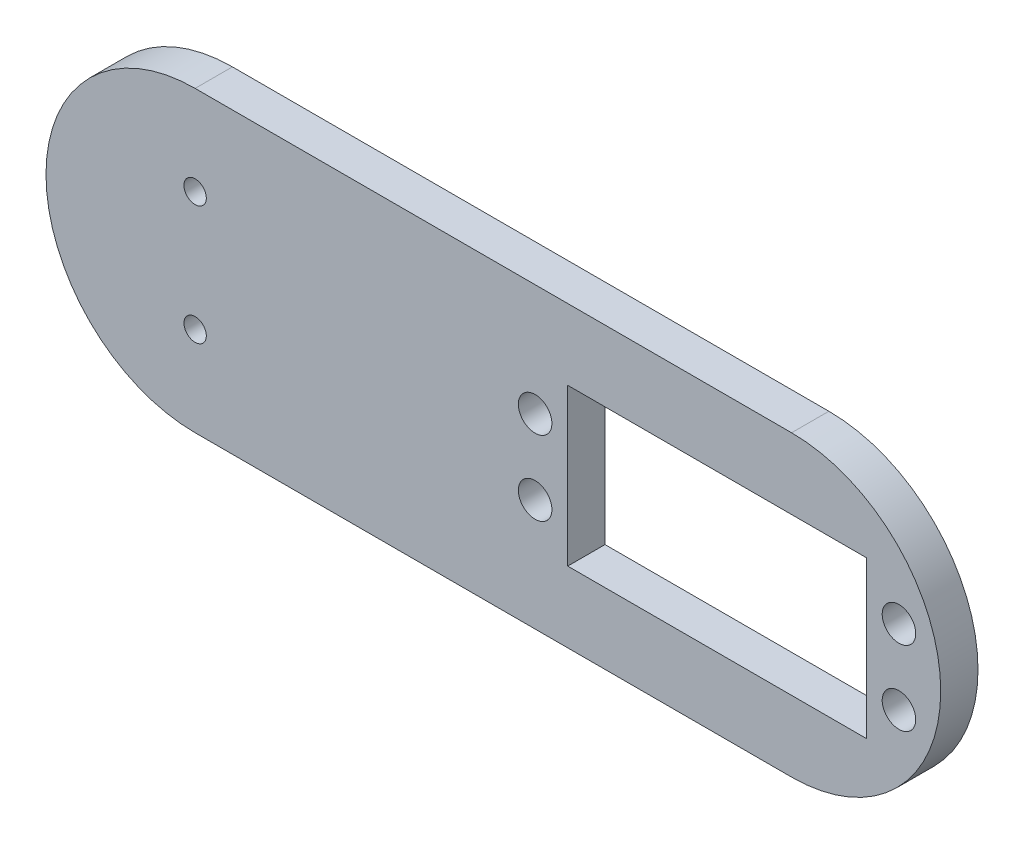
ISO-10303-21;
HEADER;
FILE_DESCRIPTION(('STEP AP214'),'2;1');
FILE_NAME('part.step','',(''),(''),'','','');
FILE_SCHEMA(('AUTOMOTIVE_DESIGN { 1 0 10303 214 1 1 1 1 }'));
ENDSEC;
DATA;
#1=APPLICATION_CONTEXT('core data for automotive mechanical design processes');
#2=APPLICATION_PROTOCOL_DEFINITION('international standard','automotive_design',2000,#1);
#3=PRODUCT_CONTEXT('',#1,'mechanical');
#4=PRODUCT('Part','Part','',(#3));
#5=PRODUCT_RELATED_PRODUCT_CATEGORY('part','',(#4));
#6=PRODUCT_DEFINITION_FORMATION('','',#4);
#7=PRODUCT_DEFINITION_CONTEXT('part definition',#1,'design');
#8=PRODUCT_DEFINITION('design','',#6,#7);
#9=PRODUCT_DEFINITION_SHAPE('','',#8);
#10=(LENGTH_UNIT() NAMED_UNIT(*) SI_UNIT(.MILLI.,.METRE.));
#11=(NAMED_UNIT(*) PLANE_ANGLE_UNIT() SI_UNIT($,.RADIAN.));
#12=(NAMED_UNIT(*) SI_UNIT($,.STERADIAN.) SOLID_ANGLE_UNIT());
#13=UNCERTAINTY_MEASURE_WITH_UNIT(LENGTH_MEASURE(1.E-05),#10,'distance_accuracy_value','');
#14=(GEOMETRIC_REPRESENTATION_CONTEXT(3) GLOBAL_UNCERTAINTY_ASSIGNED_CONTEXT((#13)) GLOBAL_UNIT_ASSIGNED_CONTEXT((#10,
#11,#12)) REPRESENTATION_CONTEXT('',''));
#15=CARTESIAN_POINT('',(0.,0.,0.));
#16=DIRECTION('',(0.,0.,1.));
#17=DIRECTION('',(1.,0.,0.));
#18=AXIS2_PLACEMENT_3D('',#15,#16,#17);
#19=CARTESIAN_POINT('',(-120.,0.,0.));
#20=DIRECTION('',(0.,0.,-1.));
#21=DIRECTION('',(0.,1.,0.));
#22=AXIS2_PLACEMENT_3D('',#19,#20,#21);
#23=CYLINDRICAL_SURFACE('',#22,20.);
#24=CARTESIAN_POINT('',(-120.,0.,-5.));
#25=DIRECTION('',(0.,0.,1.));
#26=DIRECTION('',(0.,-1.,0.));
#27=AXIS2_PLACEMENT_3D('',#24,#25,#26);
#28=CIRCLE('',#27,20.);
#29=CARTESIAN_POINT('',(-120.,20.,-4.99999999999993));
#30=VERTEX_POINT('',#29);
#31=CARTESIAN_POINT('',(-120.,-20.,-5.00000000000007));
#32=VERTEX_POINT('',#31);
#33=EDGE_CURVE('E168',#30,#32,#28,.T.);
#34=ORIENTED_EDGE('',*,*,#33,.T.);
#35=DIRECTION('',(0.,0.,-1.));
#36=VECTOR('',#35,1.);
#37=CARTESIAN_POINT('',(-120.,-20.,0.));
#38=LINE('',#37,#36);
#39=CARTESIAN_POINT('',(-120.,-20.,0.));
#40=VERTEX_POINT('',#39);
#41=EDGE_CURVE('E11',#40,#32,#38,.T.);
#42=ORIENTED_EDGE('',*,*,#41,.F.);
#43=CARTESIAN_POINT('',(-120.,0.,0.));
#44=DIRECTION('',(0.,0.,1.));
#45=DIRECTION('',(0.,-1.,0.));
#46=AXIS2_PLACEMENT_3D('',#43,#44,#45);
#47=CIRCLE('',#46,20.);
#48=CARTESIAN_POINT('',(-120.,20.,0.));
#49=VERTEX_POINT('',#48);
#50=EDGE_CURVE('E173',#49,#40,#47,.T.);
#51=ORIENTED_EDGE('',*,*,#50,.F.);
#52=DIRECTION('',(0.,0.,-1.));
#53=VECTOR('',#52,1.);
#54=CARTESIAN_POINT('',(-120.,20.,0.));
#55=LINE('',#54,#53);
#56=EDGE_CURVE('E184',#49,#30,#55,.T.);
#57=ORIENTED_EDGE('',*,*,#56,.T.);
#58=EDGE_LOOP('',(#34,#42,#51,#57));
#59=FACE_BOUND('',#58,.T.);
#60=ADVANCED_FACE('F39',(#59),#23,.T.);
#61=CARTESIAN_POINT('',(-40.,-20.,0.));
#62=DIRECTION('',(0.,-1.,0.));
#63=DIRECTION('',(1.,0.,0.));
#64=AXIS2_PLACEMENT_3D('',#61,#62,#63);
#65=PLANE('',#64);
#66=DIRECTION('',(-1.,0.,0.));
#67=VECTOR('',#66,1.);
#68=CARTESIAN_POINT('',(-40.,-20.,-5.00000000000007));
#69=LINE('',#68,#67);
#70=CARTESIAN_POINT('',(-40.,-20.,-5.00000000000007));
#71=VERTEX_POINT('',#70);
#72=EDGE_CURVE('E187',#71,#32,#69,.T.);
#73=ORIENTED_EDGE('',*,*,#72,.F.);
#74=DIRECTION('',(0.,0.,-1.));
#75=VECTOR('',#74,1.);
#76=CARTESIAN_POINT('',(-40.,-20.,0.));
#77=LINE('',#76,#75);
#78=CARTESIAN_POINT('',(-40.,-20.,0.));
#79=VERTEX_POINT('',#78);
#80=EDGE_CURVE('E46',#79,#71,#77,.T.);
#81=ORIENTED_EDGE('',*,*,#80,.F.);
#82=DIRECTION('',(-1.,0.,0.));
#83=VECTOR('',#82,1.);
#84=CARTESIAN_POINT('',(-40.,-20.,0.));
#85=LINE('',#84,#83);
#86=EDGE_CURVE('E175',#79,#40,#85,.T.);
#87=ORIENTED_EDGE('',*,*,#86,.T.);
#88=ORIENTED_EDGE('',*,*,#41,.T.);
#89=EDGE_LOOP('',(#73,#81,#87,#88));
#90=FACE_BOUND('',#89,.T.);
#91=ADVANCED_FACE('F208',(#90),#65,.T.);
#92=CARTESIAN_POINT('',(-40.,0.,0.));
#93=DIRECTION('',(0.,0.,-1.));
#94=DIRECTION('',(0.,1.,0.));
#95=AXIS2_PLACEMENT_3D('',#92,#93,#94);
#96=CYLINDRICAL_SURFACE('',#95,20.);
#97=CARTESIAN_POINT('',(-40.,0.,-5.));
#98=DIRECTION('',(0.,0.,1.));
#99=DIRECTION('',(0.,-1.,0.));
#100=AXIS2_PLACEMENT_3D('',#97,#98,#99);
#101=CIRCLE('',#100,20.);
#102=CARTESIAN_POINT('',(-40.,20.,-4.99999999999993));
#103=VERTEX_POINT('',#102);
#104=EDGE_CURVE('E190',#71,#103,#101,.T.);
#105=ORIENTED_EDGE('',*,*,#104,.T.);
#106=DIRECTION('',(0.,0.,-1.));
#107=VECTOR('',#106,1.);
#108=CARTESIAN_POINT('',(-40.,20.,0.));
#109=LINE('',#108,#107);
#110=CARTESIAN_POINT('',(-40.,20.,0.));
#111=VERTEX_POINT('',#110);
#112=EDGE_CURVE('E196',#111,#103,#109,.T.);
#113=ORIENTED_EDGE('',*,*,#112,.F.);
#114=CARTESIAN_POINT('',(-40.,0.,0.));
#115=DIRECTION('',(0.,0.,1.));
#116=DIRECTION('',(0.,-1.,0.));
#117=AXIS2_PLACEMENT_3D('',#114,#115,#116);
#118=CIRCLE('',#117,20.);
#119=EDGE_CURVE('E179',#79,#111,#118,.T.);
#120=ORIENTED_EDGE('',*,*,#119,.F.);
#121=ORIENTED_EDGE('',*,*,#80,.T.);
#122=EDGE_LOOP('',(#105,#113,#120,#121));
#123=FACE_BOUND('',#122,.T.);
#124=ADVANCED_FACE('F200',(#123),#96,.T.);
#125=CARTESIAN_POINT('',(-120.,20.,0.));
#126=DIRECTION('',(0.,1.,0.));
#127=DIRECTION('',(-1.,0.,0.));
#128=AXIS2_PLACEMENT_3D('',#125,#126,#127);
#129=PLANE('',#128);
#130=DIRECTION('',(1.,0.,0.));
#131=VECTOR('',#130,1.);
#132=CARTESIAN_POINT('',(-120.,20.,-4.99999999999993));
#133=LINE('',#132,#131);
#134=EDGE_CURVE('E176',#30,#103,#133,.T.);
#135=ORIENTED_EDGE('',*,*,#134,.F.);
#136=ORIENTED_EDGE('',*,*,#56,.F.);
#137=DIRECTION('',(1.,0.,0.));
#138=VECTOR('',#137,1.);
#139=CARTESIAN_POINT('',(-120.,20.,0.));
#140=LINE('',#139,#138);
#141=EDGE_CURVE('E181',#49,#111,#140,.T.);
#142=ORIENTED_EDGE('',*,*,#141,.T.);
#143=ORIENTED_EDGE('',*,*,#112,.T.);
#144=EDGE_LOOP('',(#135,#136,#142,#143));
#145=FACE_BOUND('',#144,.T.);
#146=ADVANCED_FACE('F213',(#145),#129,.T.);
#147=CARTESIAN_POINT('',(-120.,0.,0.));
#148=DIRECTION('',(0.,0.,1.));
#149=DIRECTION('',(0.,-1.,0.));
#150=AXIS2_PLACEMENT_3D('',#147,#148,#149);
#151=PLANE('',#150);
#152=CARTESIAN_POINT('',(-25.6,4.99999999999998,0.));
#153=DIRECTION('',(0.,0.,1.));
#154=DIRECTION('',(-1.,0.,0.));
#155=AXIS2_PLACEMENT_3D('',#152,#153,#154);
#156=CIRCLE('',#155,2.25000000000001);
#157=CARTESIAN_POINT('',(-27.85,4.99999999999998,0.));
#158=VERTEX_POINT('',#157);
#159=EDGE_CURVE('E145',#158,#158,#156,.T.);
#160=ORIENTED_EDGE('',*,*,#159,.F.);
#161=EDGE_LOOP('',(#160));
#162=FACE_BOUND('',#161,.T.);
#163=CARTESIAN_POINT('',(-74.4,-5.00000000000036,0.));
#164=DIRECTION('',(0.,0.,1.));
#165=DIRECTION('',(1.,0.,0.));
#166=AXIS2_PLACEMENT_3D('',#163,#164,#165);
#167=CIRCLE('',#166,2.25);
#168=CARTESIAN_POINT('',(-72.15,-5.00000000000036,0.));
#169=VERTEX_POINT('',#168);
#170=EDGE_CURVE('E151',#169,#169,#167,.T.);
#171=ORIENTED_EDGE('',*,*,#170,.F.);
#172=EDGE_LOOP('',(#171));
#173=FACE_BOUND('',#172,.T.);
#174=CARTESIAN_POINT('',(-74.4,4.99999999999964,0.));
#175=DIRECTION('',(0.,0.,1.));
#176=DIRECTION('',(-1.,0.,0.));
#177=AXIS2_PLACEMENT_3D('',#174,#175,#176);
#178=CIRCLE('',#177,2.25);
#179=CARTESIAN_POINT('',(-76.65,4.99999999999964,0.));
#180=VERTEX_POINT('',#179);
#181=EDGE_CURVE('E126',#180,#180,#178,.T.);
#182=ORIENTED_EDGE('',*,*,#181,.F.);
#183=EDGE_LOOP('',(#182));
#184=FACE_BOUND('',#183,.T.);
#185=DIRECTION('',(0.,1.,0.));
#186=VECTOR('',#185,1.);
#187=CARTESIAN_POINT('',(-29.975,-10.5,0.));
#188=LINE('',#187,#186);
#189=CARTESIAN_POINT('',(-29.975,-10.5,0.));
#190=VERTEX_POINT('',#189);
#191=CARTESIAN_POINT('',(-29.975,10.5,0.));
#192=VERTEX_POINT('',#191);
#193=EDGE_CURVE('E53',#190,#192,#188,.T.);
#194=ORIENTED_EDGE('',*,*,#193,.F.);
#195=DIRECTION('',(1.,0.,0.));
#196=VECTOR('',#195,1.);
#197=CARTESIAN_POINT('',(-70.025,-10.5,0.));
#198=LINE('',#197,#196);
#199=CARTESIAN_POINT('',(-70.025,-10.5,0.));
#200=VERTEX_POINT('',#199);
#201=EDGE_CURVE('E120',#200,#190,#198,.T.);
#202=ORIENTED_EDGE('',*,*,#201,.F.);
#203=DIRECTION('',(0.,-1.,0.));
#204=VECTOR('',#203,1.);
#205=CARTESIAN_POINT('',(-70.025,-10.5,0.));
#206=LINE('',#205,#204);
#207=CARTESIAN_POINT('',(-70.025,10.5,0.));
#208=VERTEX_POINT('',#207);
#209=EDGE_CURVE('E123',#208,#200,#206,.T.);
#210=ORIENTED_EDGE('',*,*,#209,.F.);
#211=DIRECTION('',(-1.,0.,0.));
#212=VECTOR('',#211,1.);
#213=CARTESIAN_POINT('',(-70.025,10.5,0.));
#214=LINE('',#213,#212);
#215=EDGE_CURVE('E132',#192,#208,#214,.T.);
#216=ORIENTED_EDGE('',*,*,#215,.F.);
#217=EDGE_LOOP('',(#194,#202,#210,#216));
#218=FACE_BOUND('',#217,.T.);
#219=CARTESIAN_POINT('',(-25.6,-5.00000000000002,0.));
#220=DIRECTION('',(0.,0.,1.));
#221=DIRECTION('',(1.,0.,0.));
#222=AXIS2_PLACEMENT_3D('',#219,#220,#221);
#223=CIRCLE('',#222,2.25000000000001);
#224=CARTESIAN_POINT('',(-23.35,-5.00000000000002,0.));
#225=VERTEX_POINT('',#224);
#226=EDGE_CURVE('E144',#225,#225,#223,.T.);
#227=ORIENTED_EDGE('',*,*,#226,.F.);
#228=EDGE_LOOP('',(#227));
#229=FACE_BOUND('',#228,.T.);
#230=CARTESIAN_POINT('',(-119.998000000016,7.99999987499999,0.));
#231=DIRECTION('',(0.,0.,1.));
#232=DIRECTION('',(0.,-1.,0.));
#233=AXIS2_PLACEMENT_3D('',#230,#231,#232);
#234=CIRCLE('',#233,1.5);
#235=CARTESIAN_POINT('',(-119.998000000016,6.49999987499999,0.));
#236=VERTEX_POINT('',#235);
#237=EDGE_CURVE('E161',#236,#236,#234,.T.);
#238=ORIENTED_EDGE('',*,*,#237,.F.);
#239=EDGE_LOOP('',(#238));
#240=FACE_BOUND('',#239,.T.);
#241=CARTESIAN_POINT('',(-119.998000000016,-8.00000025000001,0.));
#242=DIRECTION('',(0.,0.,1.));
#243=DIRECTION('',(0.,-1.,0.));
#244=AXIS2_PLACEMENT_3D('',#241,#242,#243);
#245=CIRCLE('',#244,1.5);
#246=CARTESIAN_POINT('',(-119.998000000016,-9.50000025000001,0.));
#247=VERTEX_POINT('',#246);
#248=EDGE_CURVE('E165',#247,#247,#245,.T.);
#249=ORIENTED_EDGE('',*,*,#248,.F.);
#250=EDGE_LOOP('',(#249));
#251=FACE_BOUND('',#250,.T.);
#252=ORIENTED_EDGE('',*,*,#50,.T.);
#253=ORIENTED_EDGE('',*,*,#86,.F.);
#254=ORIENTED_EDGE('',*,*,#119,.T.);
#255=ORIENTED_EDGE('',*,*,#141,.F.);
#256=EDGE_LOOP('',(#252,#253,#254,#255));
#257=FACE_BOUND('',#256,.T.);
#258=ADVANCED_FACE('F216',(#162,#173,#184,#218,#229,#240,#251,#257),#151,.T.);
#259=CARTESIAN_POINT('',(-120.,0.,-5.));
#260=DIRECTION('',(0.,0.,1.));
#261=DIRECTION('',(0.,-1.,0.));
#262=AXIS2_PLACEMENT_3D('',#259,#260,#261);
#263=PLANE('',#262);
#264=CARTESIAN_POINT('',(-25.6,4.99999999999998,-5.00000000000007));
#265=DIRECTION('',(0.,0.,1.));
#266=DIRECTION('',(-1.,0.,0.));
#267=AXIS2_PLACEMENT_3D('',#264,#265,#266);
#268=CIRCLE('',#267,2.25000000000001);
#269=CARTESIAN_POINT('',(-27.85,4.99999999999998,-5.00000000000007));
#270=VERTEX_POINT('',#269);
#271=EDGE_CURVE('E141',#270,#270,#268,.T.);
#272=ORIENTED_EDGE('',*,*,#271,.T.);
#273=EDGE_LOOP('',(#272));
#274=FACE_BOUND('',#273,.T.);
#275=CARTESIAN_POINT('',(-74.4,-5.00000000000036,-5.00000000000007));
#276=DIRECTION('',(0.,0.,1.));
#277=DIRECTION('',(1.,0.,0.));
#278=AXIS2_PLACEMENT_3D('',#275,#276,#277);
#279=CIRCLE('',#278,2.25);
#280=CARTESIAN_POINT('',(-72.15,-5.00000000000036,-5.00000000000007));
#281=VERTEX_POINT('',#280);
#282=EDGE_CURVE('E148',#281,#281,#279,.T.);
#283=ORIENTED_EDGE('',*,*,#282,.T.);
#284=EDGE_LOOP('',(#283));
#285=FACE_BOUND('',#284,.T.);
#286=CARTESIAN_POINT('',(-74.4,4.99999999999964,-5.00000000000007));
#287=DIRECTION('',(0.,0.,1.));
#288=DIRECTION('',(-1.,0.,0.));
#289=AXIS2_PLACEMENT_3D('',#286,#287,#288);
#290=CIRCLE('',#289,2.25);
#291=CARTESIAN_POINT('',(-76.65,4.99999999999964,-5.00000000000007));
#292=VERTEX_POINT('',#291);
#293=EDGE_CURVE('E154',#292,#292,#290,.T.);
#294=ORIENTED_EDGE('',*,*,#293,.T.);
#295=EDGE_LOOP('',(#294));
#296=FACE_BOUND('',#295,.T.);
#297=DIRECTION('',(1.,0.,0.));
#298=VECTOR('',#297,1.);
#299=CARTESIAN_POINT('',(-70.025,-10.5,-5.00000000000007));
#300=LINE('',#299,#298);
#301=CARTESIAN_POINT('',(-70.025,-10.5,-5.00000000000007));
#302=VERTEX_POINT('',#301);
#303=CARTESIAN_POINT('',(-29.975,-10.5,-5.00000000000007));
#304=VERTEX_POINT('',#303);
#305=EDGE_CURVE('E110',#302,#304,#300,.T.);
#306=ORIENTED_EDGE('',*,*,#305,.T.);
#307=DIRECTION('',(0.,1.,0.));
#308=VECTOR('',#307,1.);
#309=CARTESIAN_POINT('',(-29.975,-10.5,-5.00000000000007));
#310=LINE('',#309,#308);
#311=CARTESIAN_POINT('',(-29.975,10.5,-5.00000000000007));
#312=VERTEX_POINT('',#311);
#313=EDGE_CURVE('E104',#304,#312,#310,.T.);
#314=ORIENTED_EDGE('',*,*,#313,.T.);
#315=DIRECTION('',(-1.,0.,0.));
#316=VECTOR('',#315,1.);
#317=CARTESIAN_POINT('',(-70.025,10.5,-5.00000000000007));
#318=LINE('',#317,#316);
#319=CARTESIAN_POINT('',(-70.025,10.5,-4.99999999999996));
#320=VERTEX_POINT('',#319);
#321=EDGE_CURVE('E113',#312,#320,#318,.T.);
#322=ORIENTED_EDGE('',*,*,#321,.T.);
#323=DIRECTION('',(0.,-1.,0.));
#324=VECTOR('',#323,1.);
#325=CARTESIAN_POINT('',(-70.025,-10.5,-5.00000000000007));
#326=LINE('',#325,#324);
#327=EDGE_CURVE('E61',#320,#302,#326,.T.);
#328=ORIENTED_EDGE('',*,*,#327,.T.);
#329=EDGE_LOOP('',(#306,#314,#322,#328));
#330=FACE_BOUND('',#329,.T.);
#331=CARTESIAN_POINT('',(-25.6,-5.00000000000002,-5.00000000000007));
#332=DIRECTION('',(0.,0.,1.));
#333=DIRECTION('',(1.,0.,0.));
#334=AXIS2_PLACEMENT_3D('',#331,#332,#333);
#335=CIRCLE('',#334,2.25000000000001);
#336=CARTESIAN_POINT('',(-23.35,-5.00000000000002,-5.00000000000007));
#337=VERTEX_POINT('',#336);
#338=EDGE_CURVE('E155',#337,#337,#335,.T.);
#339=ORIENTED_EDGE('',*,*,#338,.T.);
#340=EDGE_LOOP('',(#339));
#341=FACE_BOUND('',#340,.T.);
#342=CARTESIAN_POINT('',(-119.998000000016,7.99999987500001,-4.99999999999997));
#343=DIRECTION('',(0.,0.,1.));
#344=DIRECTION('',(0.,-1.,0.));
#345=AXIS2_PLACEMENT_3D('',#342,#343,#344);
#346=CIRCLE('',#345,1.5);
#347=CARTESIAN_POINT('',(-119.998000000016,6.49999987500001,-4.99999999999998));
#348=VERTEX_POINT('',#347);
#349=EDGE_CURVE('E164',#348,#348,#346,.F.);
#350=ORIENTED_EDGE('',*,*,#349,.F.);
#351=EDGE_LOOP('',(#350));
#352=FACE_BOUND('',#351,.T.);
#353=CARTESIAN_POINT('',(-119.998000000016,-8.00000024999999,-5.00000000000003));
#354=DIRECTION('',(0.,0.,1.));
#355=DIRECTION('',(0.,-1.,0.));
#356=AXIS2_PLACEMENT_3D('',#353,#354,#355);
#357=CIRCLE('',#356,1.5);
#358=CARTESIAN_POINT('',(-119.998000000016,-9.50000024999999,-5.00000000000003));
#359=VERTEX_POINT('',#358);
#360=EDGE_CURVE('E158',#359,#359,#357,.F.);
#361=ORIENTED_EDGE('',*,*,#360,.F.);
#362=EDGE_LOOP('',(#361));
#363=FACE_BOUND('',#362,.T.);
#364=ORIENTED_EDGE('',*,*,#33,.F.);
#365=ORIENTED_EDGE('',*,*,#134,.T.);
#366=ORIENTED_EDGE('',*,*,#104,.F.);
#367=ORIENTED_EDGE('',*,*,#72,.T.);
#368=EDGE_LOOP('',(#364,#365,#366,#367));
#369=FACE_BOUND('',#368,.T.);
#370=ADVANCED_FACE('F117',(#274,#285,#296,#330,#341,#352,#363,#369),#263,.F.);
#371=CARTESIAN_POINT('',(-119.998000000016,-8.00000024999999,-5.00100000000003));
#372=DIRECTION('',(0.,0.,1.));
#373=DIRECTION('',(0.,-1.,0.));
#374=AXIS2_PLACEMENT_3D('',#371,#372,#373);
#375=CYLINDRICAL_SURFACE('',#374,1.5);
#376=ORIENTED_EDGE('',*,*,#248,.T.);
#377=EDGE_LOOP('',(#376));
#378=FACE_BOUND('',#377,.T.);
#379=ORIENTED_EDGE('',*,*,#360,.T.);
#380=EDGE_LOOP('',(#379));
#381=FACE_BOUND('',#380,.T.);
#382=ADVANCED_FACE('F224',(#378,#381),#375,.F.);
#383=CARTESIAN_POINT('',(-119.998000000016,7.99999987500001,-5.00099999999997));
#384=DIRECTION('',(0.,0.,1.));
#385=DIRECTION('',(0.,-1.,0.));
#386=AXIS2_PLACEMENT_3D('',#383,#384,#385);
#387=CYLINDRICAL_SURFACE('',#386,1.5);
#388=ORIENTED_EDGE('',*,*,#237,.T.);
#389=EDGE_LOOP('',(#388));
#390=FACE_BOUND('',#389,.T.);
#391=ORIENTED_EDGE('',*,*,#349,.T.);
#392=EDGE_LOOP('',(#391));
#393=FACE_BOUND('',#392,.T.);
#394=ADVANCED_FACE('F268',(#390,#393),#387,.F.);
#395=CARTESIAN_POINT('',(-25.6,-5.00000000000002,-5.00000000000007));
#396=DIRECTION('',(0.,0.,1.));
#397=DIRECTION('',(1.,0.,0.));
#398=AXIS2_PLACEMENT_3D('',#395,#396,#397);
#399=CYLINDRICAL_SURFACE('',#398,2.25000000000001);
#400=ORIENTED_EDGE('',*,*,#338,.F.);
#401=EDGE_LOOP('',(#400));
#402=FACE_BOUND('',#401,.T.);
#403=ORIENTED_EDGE('',*,*,#226,.T.);
#404=EDGE_LOOP('',(#403));
#405=FACE_BOUND('',#404,.T.);
#406=ADVANCED_FACE('F277',(#402,#405),#399,.F.);
#407=CARTESIAN_POINT('',(-29.975,-10.5,-5.00000000000007));
#408=DIRECTION('',(1.,0.,0.));
#409=DIRECTION('',(0.,0.,-1.));
#410=AXIS2_PLACEMENT_3D('',#407,#408,#409);
#411=PLANE('',#410);
#412=ORIENTED_EDGE('',*,*,#193,.T.);
#413=DIRECTION('',(0.,0.,1.));
#414=VECTOR('',#413,1.);
#415=CARTESIAN_POINT('',(-29.975,10.5,-5.00000000000007));
#416=LINE('',#415,#414);
#417=EDGE_CURVE('E100',#312,#192,#416,.T.);
#418=ORIENTED_EDGE('',*,*,#417,.F.);
#419=ORIENTED_EDGE('',*,*,#313,.F.);
#420=DIRECTION('',(0.,0.,1.));
#421=VECTOR('',#420,1.);
#422=CARTESIAN_POINT('',(-29.975,-10.5,-5.00000000000007));
#423=LINE('',#422,#421);
#424=EDGE_CURVE('E136',#304,#190,#423,.T.);
#425=ORIENTED_EDGE('',*,*,#424,.T.);
#426=EDGE_LOOP('',(#412,#418,#419,#425));
#427=FACE_BOUND('',#426,.T.);
#428=ADVANCED_FACE('F102',(#427),#411,.F.);
#429=CARTESIAN_POINT('',(-70.025,-10.5,-5.00000000000007));
#430=DIRECTION('',(0.,-1.,0.));
#431=DIRECTION('',(0.,0.,-1.));
#432=AXIS2_PLACEMENT_3D('',#429,#430,#431);
#433=PLANE('',#432);
#434=ORIENTED_EDGE('',*,*,#201,.T.);
#435=ORIENTED_EDGE('',*,*,#424,.F.);
#436=ORIENTED_EDGE('',*,*,#305,.F.);
#437=DIRECTION('',(0.,0.,1.));
#438=VECTOR('',#437,1.);
#439=CARTESIAN_POINT('',(-70.025,-10.5,-5.00000000000007));
#440=LINE('',#439,#438);
#441=EDGE_CURVE('E138',#302,#200,#440,.T.);
#442=ORIENTED_EDGE('',*,*,#441,.T.);
#443=EDGE_LOOP('',(#434,#435,#436,#442));
#444=FACE_BOUND('',#443,.T.);
#445=ADVANCED_FACE('F296',(#444),#433,.F.);
#446=CARTESIAN_POINT('',(-70.025,-10.5,-5.00000000000007));
#447=DIRECTION('',(-1.,0.,0.));
#448=DIRECTION('',(0.,0.,1.));
#449=AXIS2_PLACEMENT_3D('',#446,#447,#448);
#450=PLANE('',#449);
#451=ORIENTED_EDGE('',*,*,#209,.T.);
#452=ORIENTED_EDGE('',*,*,#441,.F.);
#453=ORIENTED_EDGE('',*,*,#327,.F.);
#454=DIRECTION('',(0.,0.,1.));
#455=VECTOR('',#454,1.);
#456=CARTESIAN_POINT('',(-70.025,10.5,-5.00000000000007));
#457=LINE('',#456,#455);
#458=EDGE_CURVE('E109',#320,#208,#457,.T.);
#459=ORIENTED_EDGE('',*,*,#458,.T.);
#460=EDGE_LOOP('',(#451,#452,#453,#459));
#461=FACE_BOUND('',#460,.T.);
#462=ADVANCED_FACE('F305',(#461),#450,.F.);
#463=CARTESIAN_POINT('',(-70.025,10.5,-5.00000000000007));
#464=DIRECTION('',(0.,1.,0.));
#465=DIRECTION('',(0.,0.,1.));
#466=AXIS2_PLACEMENT_3D('',#463,#464,#465);
#467=PLANE('',#466);
#468=ORIENTED_EDGE('',*,*,#215,.T.);
#469=ORIENTED_EDGE('',*,*,#458,.F.);
#470=ORIENTED_EDGE('',*,*,#321,.F.);
#471=ORIENTED_EDGE('',*,*,#417,.T.);
#472=EDGE_LOOP('',(#468,#469,#470,#471));
#473=FACE_BOUND('',#472,.T.);
#474=ADVANCED_FACE('F114',(#473),#467,.F.);
#475=CARTESIAN_POINT('',(-74.4,4.99999999999964,-5.00000000000007));
#476=DIRECTION('',(0.,0.,1.));
#477=DIRECTION('',(1.,0.,0.));
#478=AXIS2_PLACEMENT_3D('',#475,#476,#477);
#479=CYLINDRICAL_SURFACE('',#478,2.25);
#480=ORIENTED_EDGE('',*,*,#293,.F.);
#481=EDGE_LOOP('',(#480));
#482=FACE_BOUND('',#481,.T.);
#483=ORIENTED_EDGE('',*,*,#181,.T.);
#484=EDGE_LOOP('',(#483));
#485=FACE_BOUND('',#484,.T.);
#486=ADVANCED_FACE('F323',(#482,#485),#479,.F.);
#487=CARTESIAN_POINT('',(-74.4,-5.00000000000036,-5.00000000000007));
#488=DIRECTION('',(0.,0.,1.));
#489=DIRECTION('',(1.,0.,0.));
#490=AXIS2_PLACEMENT_3D('',#487,#488,#489);
#491=CYLINDRICAL_SURFACE('',#490,2.25);
#492=ORIENTED_EDGE('',*,*,#282,.F.);
#493=EDGE_LOOP('',(#492));
#494=FACE_BOUND('',#493,.T.);
#495=ORIENTED_EDGE('',*,*,#170,.T.);
#496=EDGE_LOOP('',(#495));
#497=FACE_BOUND('',#496,.T.);
#498=ADVANCED_FACE('F332',(#494,#497),#491,.F.);
#499=CARTESIAN_POINT('',(-25.6,4.99999999999998,-5.00000000000007));
#500=DIRECTION('',(0.,0.,1.));
#501=DIRECTION('',(1.,0.,0.));
#502=AXIS2_PLACEMENT_3D('',#499,#500,#501);
#503=CYLINDRICAL_SURFACE('',#502,2.25000000000001);
#504=ORIENTED_EDGE('',*,*,#271,.F.);
#505=EDGE_LOOP('',(#504));
#506=FACE_BOUND('',#505,.T.);
#507=ORIENTED_EDGE('',*,*,#159,.T.);
#508=EDGE_LOOP('',(#507));
#509=FACE_BOUND('',#508,.T.);
#510=ADVANCED_FACE('F342',(#506,#509),#503,.F.);
#511=CLOSED_SHELL('',(#60,#91,#124,#146,#258,#370,#382,#394,#406,#428,#445,#462,#474,#486,#498,#510));
#512=MANIFOLD_SOLID_BREP('B2',#511);
#513=ADVANCED_BREP_SHAPE_REPRESENTATION('',(#18,#512),#14);
#514=SHAPE_DEFINITION_REPRESENTATION(#9,#513);
ENDSEC;
END-ISO-10303-21;
